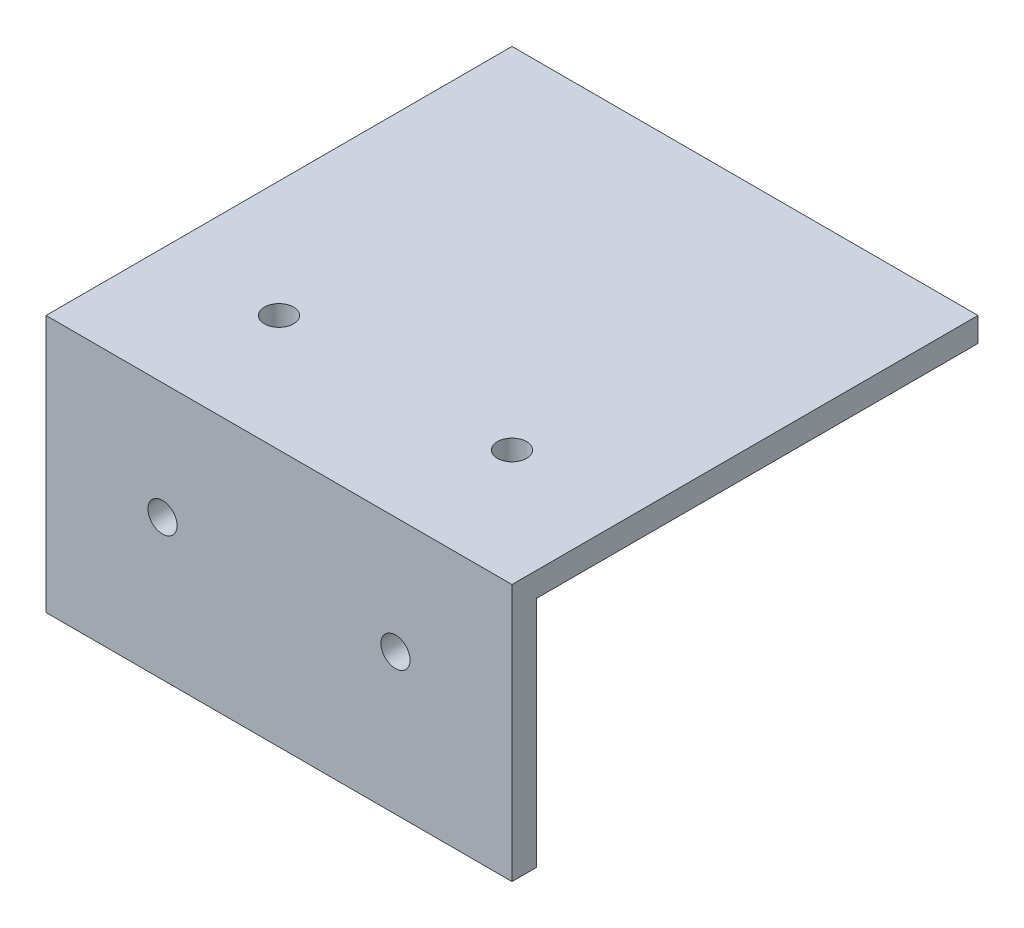
ISO-10303-21;
HEADER;
FILE_DESCRIPTION(('STEP AP214'),'2;1');
FILE_NAME('part.step','',(''),(''),'','','');
FILE_SCHEMA(('AUTOMOTIVE_DESIGN { 1 0 10303 214 1 1 1 1 }'));
ENDSEC;
DATA;
#1=APPLICATION_CONTEXT('core data for automotive mechanical design processes');
#2=APPLICATION_PROTOCOL_DEFINITION('international standard','automotive_design',2000,#1);
#3=PRODUCT_CONTEXT('',#1,'mechanical');
#4=PRODUCT('Part','Part','',(#3));
#5=PRODUCT_RELATED_PRODUCT_CATEGORY('part','',(#4));
#6=PRODUCT_DEFINITION_FORMATION('','',#4);
#7=PRODUCT_DEFINITION_CONTEXT('part definition',#1,'design');
#8=PRODUCT_DEFINITION('design','',#6,#7);
#9=PRODUCT_DEFINITION_SHAPE('','',#8);
#10=(LENGTH_UNIT() NAMED_UNIT(*) SI_UNIT(.MILLI.,.METRE.));
#11=(NAMED_UNIT(*) PLANE_ANGLE_UNIT() SI_UNIT($,.RADIAN.));
#12=(NAMED_UNIT(*) SI_UNIT($,.STERADIAN.) SOLID_ANGLE_UNIT());
#13=UNCERTAINTY_MEASURE_WITH_UNIT(LENGTH_MEASURE(1.E-05),#10,'distance_accuracy_value','');
#14=(GEOMETRIC_REPRESENTATION_CONTEXT(3) GLOBAL_UNCERTAINTY_ASSIGNED_CONTEXT((#13)) GLOBAL_UNIT_ASSIGNED_CONTEXT((#10,
#11,#12)) REPRESENTATION_CONTEXT('',''));
#15=CARTESIAN_POINT('',(0.,0.,0.));
#16=DIRECTION('',(0.,0.,1.));
#17=DIRECTION('',(1.,0.,0.));
#18=AXIS2_PLACEMENT_3D('',#15,#16,#17);
#19=CARTESIAN_POINT('',(0.,3.175,0.));
#20=DIRECTION('',(1.,0.,0.));
#21=DIRECTION('',(0.,0.,-1.));
#22=AXIS2_PLACEMENT_3D('',#19,#20,#21);
#23=PLANE('',#22);
#24=DIRECTION('',(0.,0.,1.));
#25=VECTOR('',#24,1.);
#26=CARTESIAN_POINT('',(0.,0.,0.));
#27=LINE('',#26,#25);
#28=CARTESIAN_POINT('',(0.,0.,-60.96));
#29=VERTEX_POINT('',#28);
#30=CARTESIAN_POINT('',(0.,0.,-3.175));
#31=VERTEX_POINT('',#30);
#32=EDGE_CURVE('E129',#29,#31,#27,.T.);
#33=ORIENTED_EDGE('',*,*,#32,.T.);
#34=DIRECTION('',(0.,1.,0.));
#35=VECTOR('',#34,1.);
#36=CARTESIAN_POINT('',(0.,-30.48,-3.175));
#37=LINE('',#36,#35);
#38=CARTESIAN_POINT('',(0.,-30.48,-3.175));
#39=VERTEX_POINT('',#38);
#40=EDGE_CURVE('E110',#39,#31,#37,.T.);
#41=ORIENTED_EDGE('',*,*,#40,.F.);
#42=DIRECTION('',(0.,0.,-1.));
#43=VECTOR('',#42,1.);
#44=CARTESIAN_POINT('',(0.,-30.48,0.));
#45=LINE('',#44,#43);
#46=CARTESIAN_POINT('',(0.,-30.48,0.));
#47=VERTEX_POINT('',#46);
#48=EDGE_CURVE('E118',#47,#39,#45,.T.);
#49=ORIENTED_EDGE('',*,*,#48,.F.);
#50=DIRECTION('',(0.,-1.,0.));
#51=VECTOR('',#50,1.);
#52=CARTESIAN_POINT('',(0.,3.175,0.));
#53=LINE('',#52,#51);
#54=CARTESIAN_POINT('',(0.,3.175,0.));
#55=VERTEX_POINT('',#54);
#56=EDGE_CURVE('E11',#55,#47,#53,.T.);
#57=ORIENTED_EDGE('',*,*,#56,.F.);
#58=DIRECTION('',(0.,0.,1.));
#59=VECTOR('',#58,1.);
#60=CARTESIAN_POINT('',(0.,3.175,0.));
#61=LINE('',#60,#59);
#62=CARTESIAN_POINT('',(0.,3.175,-60.96));
#63=VERTEX_POINT('',#62);
#64=EDGE_CURVE('E152',#63,#55,#61,.T.);
#65=ORIENTED_EDGE('',*,*,#64,.F.);
#66=DIRECTION('',(0.,-1.,0.));
#67=VECTOR('',#66,1.);
#68=CARTESIAN_POINT('',(0.,3.175,-60.96));
#69=LINE('',#68,#67);
#70=EDGE_CURVE('E162',#63,#29,#69,.T.);
#71=ORIENTED_EDGE('',*,*,#70,.T.);
#72=EDGE_LOOP('',(#33,#41,#49,#57,#65,#71));
#73=FACE_BOUND('',#72,.T.);
#74=ADVANCED_FACE('F43',(#73),#23,.F.);
#75=CARTESIAN_POINT('',(0.,3.175,0.));
#76=DIRECTION('',(0.,0.,-1.));
#77=DIRECTION('',(-1.,0.,0.));
#78=AXIS2_PLACEMENT_3D('',#75,#76,#77);
#79=PLANE('',#78);
#80=CARTESIAN_POINT('',(15.24,-12.065,0.));
#81=DIRECTION('',(0.,0.,1.));
#82=DIRECTION('',(1.,0.,0.));
#83=AXIS2_PLACEMENT_3D('',#80,#81,#82);
#84=CIRCLE('',#83,1.90499999999999);
#85=CARTESIAN_POINT('',(17.145,-12.065,0.));
#86=VERTEX_POINT('',#85);
#87=EDGE_CURVE('E197',#86,#86,#84,.T.);
#88=ORIENTED_EDGE('',*,*,#87,.F.);
#89=EDGE_LOOP('',(#88));
#90=FACE_BOUND('',#89,.T.);
#91=CARTESIAN_POINT('',(45.72,-12.065,0.));
#92=DIRECTION('',(0.,0.,1.));
#93=DIRECTION('',(1.,0.,0.));
#94=AXIS2_PLACEMENT_3D('',#91,#92,#93);
#95=CIRCLE('',#94,1.90499999999999);
#96=CARTESIAN_POINT('',(47.625,-12.065,0.));
#97=VERTEX_POINT('',#96);
#98=EDGE_CURVE('E189',#97,#97,#95,.T.);
#99=ORIENTED_EDGE('',*,*,#98,.F.);
#100=EDGE_LOOP('',(#99));
#101=FACE_BOUND('',#100,.T.);
#102=ORIENTED_EDGE('',*,*,#56,.T.);
#103=DIRECTION('',(-1.,0.,0.));
#104=VECTOR('',#103,1.);
#105=CARTESIAN_POINT('',(0.,-30.48,0.));
#106=LINE('',#105,#104);
#107=CARTESIAN_POINT('',(60.96,-30.48,0.));
#108=VERTEX_POINT('',#107);
#109=EDGE_CURVE('E124',#108,#47,#106,.T.);
#110=ORIENTED_EDGE('',*,*,#109,.F.);
#111=DIRECTION('',(0.,-1.,0.));
#112=VECTOR('',#111,1.);
#113=CARTESIAN_POINT('',(60.96,3.175,0.));
#114=LINE('',#113,#112);
#115=CARTESIAN_POINT('',(60.96,3.175,0.));
#116=VERTEX_POINT('',#115);
#117=EDGE_CURVE('E52',#116,#108,#114,.T.);
#118=ORIENTED_EDGE('',*,*,#117,.F.);
#119=DIRECTION('',(1.,0.,0.));
#120=VECTOR('',#119,1.);
#121=CARTESIAN_POINT('',(0.,3.175,0.));
#122=LINE('',#121,#120);
#123=EDGE_CURVE('E90',#55,#116,#122,.T.);
#124=ORIENTED_EDGE('',*,*,#123,.F.);
#125=EDGE_LOOP('',(#102,#110,#118,#124));
#126=FACE_BOUND('',#125,.T.);
#127=ADVANCED_FACE('F182',(#90,#101,#126),#79,.F.);
#128=CARTESIAN_POINT('',(60.96,3.175,0.));
#129=DIRECTION('',(-1.,0.,0.));
#130=DIRECTION('',(0.,0.,1.));
#131=AXIS2_PLACEMENT_3D('',#128,#129,#130);
#132=PLANE('',#131);
#133=ORIENTED_EDGE('',*,*,#117,.T.);
#134=DIRECTION('',(0.,0.,1.));
#135=VECTOR('',#134,1.);
#136=CARTESIAN_POINT('',(60.96,-30.48,0.));
#137=LINE('',#136,#135);
#138=CARTESIAN_POINT('',(60.96,-30.48,-3.175));
#139=VERTEX_POINT('',#138);
#140=EDGE_CURVE('E117',#139,#108,#137,.T.);
#141=ORIENTED_EDGE('',*,*,#140,.F.);
#142=DIRECTION('',(0.,1.,0.));
#143=VECTOR('',#142,1.);
#144=CARTESIAN_POINT('',(60.96,-30.48,-3.175));
#145=LINE('',#144,#143);
#146=CARTESIAN_POINT('',(60.96,0.,-3.175));
#147=VERTEX_POINT('',#146);
#148=EDGE_CURVE('E112',#139,#147,#145,.T.);
#149=ORIENTED_EDGE('',*,*,#148,.T.);
#150=DIRECTION('',(0.,0.,-1.));
#151=VECTOR('',#150,1.);
#152=CARTESIAN_POINT('',(60.96,0.,0.));
#153=LINE('',#152,#151);
#154=CARTESIAN_POINT('',(60.96,0.,-60.96));
#155=VERTEX_POINT('',#154);
#156=EDGE_CURVE('E165',#147,#155,#153,.T.);
#157=ORIENTED_EDGE('',*,*,#156,.T.);
#158=DIRECTION('',(0.,-1.,0.));
#159=VECTOR('',#158,1.);
#160=CARTESIAN_POINT('',(60.96,3.175,-60.96));
#161=LINE('',#160,#159);
#162=CARTESIAN_POINT('',(60.96,3.175,-60.96));
#163=VERTEX_POINT('',#162);
#164=EDGE_CURVE('E172',#163,#155,#161,.T.);
#165=ORIENTED_EDGE('',*,*,#164,.F.);
#166=DIRECTION('',(0.,0.,-1.));
#167=VECTOR('',#166,1.);
#168=CARTESIAN_POINT('',(60.96,3.175,0.));
#169=LINE('',#168,#167);
#170=EDGE_CURVE('E157',#116,#163,#169,.T.);
#171=ORIENTED_EDGE('',*,*,#170,.F.);
#172=EDGE_LOOP('',(#133,#141,#149,#157,#165,#171));
#173=FACE_BOUND('',#172,.T.);
#174=ADVANCED_FACE('F178',(#173),#132,.F.);
#175=CARTESIAN_POINT('',(0.,3.175,-60.96));
#176=DIRECTION('',(0.,0.,1.));
#177=DIRECTION('',(1.,0.,0.));
#178=AXIS2_PLACEMENT_3D('',#175,#176,#177);
#179=PLANE('',#178);
#180=DIRECTION('',(-1.,0.,0.));
#181=VECTOR('',#180,1.);
#182=CARTESIAN_POINT('',(0.,0.,-60.96));
#183=LINE('',#182,#181);
#184=EDGE_CURVE('E83',#155,#29,#183,.T.);
#185=ORIENTED_EDGE('',*,*,#184,.T.);
#186=ORIENTED_EDGE('',*,*,#70,.F.);
#187=DIRECTION('',(-1.,0.,0.));
#188=VECTOR('',#187,1.);
#189=CARTESIAN_POINT('',(0.,3.175,-60.96));
#190=LINE('',#189,#188);
#191=EDGE_CURVE('E68',#163,#63,#190,.T.);
#192=ORIENTED_EDGE('',*,*,#191,.F.);
#193=ORIENTED_EDGE('',*,*,#164,.T.);
#194=EDGE_LOOP('',(#185,#186,#192,#193));
#195=FACE_BOUND('',#194,.T.);
#196=ADVANCED_FACE('F224',(#195),#179,.F.);
#197=CARTESIAN_POINT('',(0.,3.175,0.));
#198=DIRECTION('',(0.,-1.,0.));
#199=DIRECTION('',(0.,0.,-1.));
#200=AXIS2_PLACEMENT_3D('',#197,#198,#199);
#201=PLANE('',#200);
#202=CARTESIAN_POINT('',(15.24,3.175,-15.24));
#203=DIRECTION('',(0.,1.,0.));
#204=DIRECTION('',(0.,0.,1.));
#205=AXIS2_PLACEMENT_3D('',#202,#203,#204);
#206=CIRCLE('',#205,1.905);
#207=CARTESIAN_POINT('',(15.24,3.175,-13.335));
#208=VERTEX_POINT('',#207);
#209=EDGE_CURVE('E131',#208,#208,#206,.T.);
#210=ORIENTED_EDGE('',*,*,#209,.F.);
#211=EDGE_LOOP('',(#210));
#212=FACE_BOUND('',#211,.T.);
#213=CARTESIAN_POINT('',(45.72,3.175,-15.24));
#214=DIRECTION('',(0.,1.,0.));
#215=DIRECTION('',(0.,0.,1.));
#216=AXIS2_PLACEMENT_3D('',#213,#214,#215);
#217=CIRCLE('',#216,1.905);
#218=CARTESIAN_POINT('',(45.72,3.175,-13.335));
#219=VERTEX_POINT('',#218);
#220=EDGE_CURVE('E144',#219,#219,#217,.T.);
#221=ORIENTED_EDGE('',*,*,#220,.F.);
#222=EDGE_LOOP('',(#221));
#223=FACE_BOUND('',#222,.T.);
#224=ORIENTED_EDGE('',*,*,#64,.T.);
#225=ORIENTED_EDGE('',*,*,#123,.T.);
#226=ORIENTED_EDGE('',*,*,#170,.T.);
#227=ORIENTED_EDGE('',*,*,#191,.T.);
#228=EDGE_LOOP('',(#224,#225,#226,#227));
#229=FACE_BOUND('',#228,.T.);
#230=ADVANCED_FACE('F230',(#212,#223,#229),#201,.F.);
#231=CARTESIAN_POINT('',(0.,0.,0.));
#232=DIRECTION('',(0.,-1.,0.));
#233=DIRECTION('',(0.,0.,-1.));
#234=AXIS2_PLACEMENT_3D('',#231,#232,#233);
#235=PLANE('',#234);
#236=DIRECTION('',(1.,0.,0.));
#237=VECTOR('',#236,1.);
#238=CARTESIAN_POINT('',(0.,0.,-3.175));
#239=LINE('',#238,#237);
#240=EDGE_CURVE('E59',#31,#147,#239,.T.);
#241=ORIENTED_EDGE('',*,*,#240,.F.);
#242=ORIENTED_EDGE('',*,*,#32,.F.);
#243=ORIENTED_EDGE('',*,*,#184,.F.);
#244=ORIENTED_EDGE('',*,*,#156,.F.);
#245=EDGE_LOOP('',(#241,#242,#243,#244));
#246=FACE_BOUND('',#245,.T.);
#247=CARTESIAN_POINT('',(15.24,0.,-15.24));
#248=DIRECTION('',(0.,1.,0.));
#249=DIRECTION('',(0.,0.,1.));
#250=AXIS2_PLACEMENT_3D('',#247,#248,#249);
#251=CIRCLE('',#250,1.905);
#252=CARTESIAN_POINT('',(15.24,0.,-13.335));
#253=VERTEX_POINT('',#252);
#254=EDGE_CURVE('E136',#253,#253,#251,.T.);
#255=ORIENTED_EDGE('',*,*,#254,.T.);
#256=EDGE_LOOP('',(#255));
#257=FACE_BOUND('',#256,.T.);
#258=CARTESIAN_POINT('',(45.72,0.,-15.24));
#259=DIRECTION('',(0.,1.,0.));
#260=DIRECTION('',(0.,0.,1.));
#261=AXIS2_PLACEMENT_3D('',#258,#259,#260);
#262=CIRCLE('',#261,1.905);
#263=CARTESIAN_POINT('',(45.72,0.,-13.335));
#264=VERTEX_POINT('',#263);
#265=EDGE_CURVE('E148',#264,#264,#262,.T.);
#266=ORIENTED_EDGE('',*,*,#265,.T.);
#267=EDGE_LOOP('',(#266));
#268=FACE_BOUND('',#267,.T.);
#269=ADVANCED_FACE('F231',(#246,#257,#268),#235,.T.);
#270=CARTESIAN_POINT('',(45.72,3.175,-15.24));
#271=DIRECTION('',(0.,1.,0.));
#272=DIRECTION('',(0.,0.,1.));
#273=AXIS2_PLACEMENT_3D('',#270,#271,#272);
#274=CYLINDRICAL_SURFACE('',#273,1.905);
#275=ORIENTED_EDGE('',*,*,#265,.F.);
#276=EDGE_LOOP('',(#275));
#277=FACE_BOUND('',#276,.T.);
#278=ORIENTED_EDGE('',*,*,#220,.T.);
#279=EDGE_LOOP('',(#278));
#280=FACE_BOUND('',#279,.T.);
#281=ADVANCED_FACE('F234',(#277,#280),#274,.F.);
#282=CARTESIAN_POINT('',(15.24,3.175,-15.24));
#283=DIRECTION('',(0.,1.,0.));
#284=DIRECTION('',(0.,0.,1.));
#285=AXIS2_PLACEMENT_3D('',#282,#283,#284);
#286=CYLINDRICAL_SURFACE('',#285,1.905);
#287=ORIENTED_EDGE('',*,*,#254,.F.);
#288=EDGE_LOOP('',(#287));
#289=FACE_BOUND('',#288,.T.);
#290=ORIENTED_EDGE('',*,*,#209,.T.);
#291=EDGE_LOOP('',(#290));
#292=FACE_BOUND('',#291,.T.);
#293=ADVANCED_FACE('F240',(#289,#292),#286,.F.);
#294=CARTESIAN_POINT('',(0.,-30.48,-3.175));
#295=DIRECTION('',(0.,0.,1.));
#296=DIRECTION('',(1.,0.,0.));
#297=AXIS2_PLACEMENT_3D('',#294,#295,#296);
#298=PLANE('',#297);
#299=CARTESIAN_POINT('',(15.24,-12.065,-3.175));
#300=DIRECTION('',(0.,0.,1.));
#301=DIRECTION('',(1.,0.,0.));
#302=AXIS2_PLACEMENT_3D('',#299,#300,#301);
#303=CIRCLE('',#302,1.90499999999999);
#304=CARTESIAN_POINT('',(17.145,-12.065,-3.175));
#305=VERTEX_POINT('',#304);
#306=EDGE_CURVE('E46',#305,#305,#303,.T.);
#307=ORIENTED_EDGE('',*,*,#306,.T.);
#308=EDGE_LOOP('',(#307));
#309=FACE_BOUND('',#308,.T.);
#310=CARTESIAN_POINT('',(45.72,-12.065,-3.175));
#311=DIRECTION('',(0.,0.,1.));
#312=DIRECTION('',(1.,0.,0.));
#313=AXIS2_PLACEMENT_3D('',#310,#311,#312);
#314=CIRCLE('',#313,1.90499999999999);
#315=CARTESIAN_POINT('',(47.625,-12.065,-3.175));
#316=VERTEX_POINT('',#315);
#317=EDGE_CURVE('E186',#316,#316,#314,.T.);
#318=ORIENTED_EDGE('',*,*,#317,.T.);
#319=EDGE_LOOP('',(#318));
#320=FACE_BOUND('',#319,.T.);
#321=ORIENTED_EDGE('',*,*,#240,.T.);
#322=ORIENTED_EDGE('',*,*,#148,.F.);
#323=DIRECTION('',(1.,0.,0.));
#324=VECTOR('',#323,1.);
#325=CARTESIAN_POINT('',(0.,-30.48,-3.175));
#326=LINE('',#325,#324);
#327=EDGE_CURVE('E106',#39,#139,#326,.T.);
#328=ORIENTED_EDGE('',*,*,#327,.F.);
#329=ORIENTED_EDGE('',*,*,#40,.T.);
#330=EDGE_LOOP('',(#321,#322,#328,#329));
#331=FACE_BOUND('',#330,.T.);
#332=ADVANCED_FACE('F108',(#309,#320,#331),#298,.F.);
#333=CARTESIAN_POINT('',(0.,-30.48,0.));
#334=DIRECTION('',(0.,-1.,0.));
#335=DIRECTION('',(0.,0.,-1.));
#336=AXIS2_PLACEMENT_3D('',#333,#334,#335);
#337=PLANE('',#336);
#338=ORIENTED_EDGE('',*,*,#48,.T.);
#339=ORIENTED_EDGE('',*,*,#327,.T.);
#340=ORIENTED_EDGE('',*,*,#140,.T.);
#341=ORIENTED_EDGE('',*,*,#109,.T.);
#342=EDGE_LOOP('',(#338,#339,#340,#341));
#343=FACE_BOUND('',#342,.T.);
#344=ADVANCED_FACE('F122',(#343),#337,.T.);
#345=CARTESIAN_POINT('',(45.72,-12.065,0.));
#346=DIRECTION('',(0.,0.,1.));
#347=DIRECTION('',(1.,0.,0.));
#348=AXIS2_PLACEMENT_3D('',#345,#346,#347);
#349=CYLINDRICAL_SURFACE('',#348,1.90499999999999);
#350=ORIENTED_EDGE('',*,*,#98,.T.);
#351=EDGE_LOOP('',(#350));
#352=FACE_BOUND('',#351,.T.);
#353=ORIENTED_EDGE('',*,*,#317,.F.);
#354=EDGE_LOOP('',(#353));
#355=FACE_BOUND('',#354,.T.);
#356=ADVANCED_FACE('F209',(#352,#355),#349,.F.);
#357=CARTESIAN_POINT('',(15.24,-12.065,0.));
#358=DIRECTION('',(0.,0.,1.));
#359=DIRECTION('',(1.,0.,0.));
#360=AXIS2_PLACEMENT_3D('',#357,#358,#359);
#361=CYLINDRICAL_SURFACE('',#360,1.90499999999999);
#362=ORIENTED_EDGE('',*,*,#87,.T.);
#363=EDGE_LOOP('',(#362));
#364=FACE_BOUND('',#363,.T.);
#365=ORIENTED_EDGE('',*,*,#306,.F.);
#366=EDGE_LOOP('',(#365));
#367=FACE_BOUND('',#366,.T.);
#368=ADVANCED_FACE('F207',(#364,#367),#361,.F.);
#369=CLOSED_SHELL('',(#74,#127,#174,#196,#230,#269,#281,#293,#332,#344,#356,#368));
#370=MANIFOLD_SOLID_BREP('B2',#369);
#371=ADVANCED_BREP_SHAPE_REPRESENTATION('',(#18,#370),#14);
#372=SHAPE_DEFINITION_REPRESENTATION(#9,#371);
ENDSEC;
END-ISO-10303-21;
